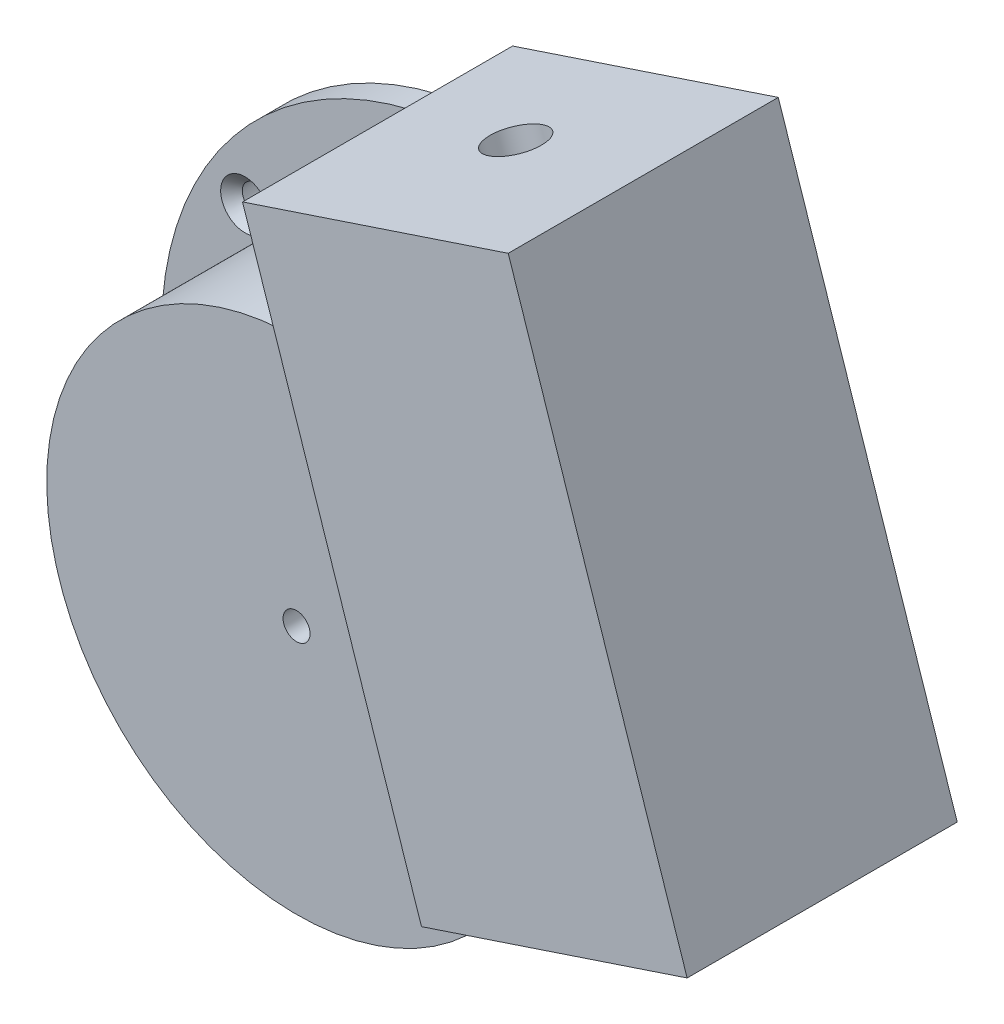
ISO-10303-21;
HEADER;
FILE_DESCRIPTION(('STEP AP214'),'2;1');
FILE_NAME('part.step','',(''),(''),'','','');
FILE_SCHEMA(('AUTOMOTIVE_DESIGN { 1 0 10303 214 1 1 1 1 }'));
ENDSEC;
DATA;
#1=APPLICATION_CONTEXT('core data for automotive mechanical design processes');
#2=APPLICATION_PROTOCOL_DEFINITION('international standard','automotive_design',2000,#1);
#3=PRODUCT_CONTEXT('',#1,'mechanical');
#4=PRODUCT('Part','Part','',(#3));
#5=PRODUCT_RELATED_PRODUCT_CATEGORY('part','',(#4));
#6=PRODUCT_DEFINITION_FORMATION('','',#4);
#7=PRODUCT_DEFINITION_CONTEXT('part definition',#1,'design');
#8=PRODUCT_DEFINITION('design','',#6,#7);
#9=PRODUCT_DEFINITION_SHAPE('','',#8);
#10=(LENGTH_UNIT() NAMED_UNIT(*) SI_UNIT(.MILLI.,.METRE.));
#11=(NAMED_UNIT(*) PLANE_ANGLE_UNIT() SI_UNIT($,.RADIAN.));
#12=(NAMED_UNIT(*) SI_UNIT($,.STERADIAN.) SOLID_ANGLE_UNIT());
#13=UNCERTAINTY_MEASURE_WITH_UNIT(LENGTH_MEASURE(1.E-05),#10,'distance_accuracy_value','');
#14=(GEOMETRIC_REPRESENTATION_CONTEXT(3) GLOBAL_UNCERTAINTY_ASSIGNED_CONTEXT((#13)) GLOBAL_UNIT_ASSIGNED_CONTEXT((#10,
#11,#12)) REPRESENTATION_CONTEXT('',''));
#15=CARTESIAN_POINT('',(0.,0.,0.));
#16=DIRECTION('',(0.,0.,1.));
#17=DIRECTION('',(1.,0.,0.));
#18=AXIS2_PLACEMENT_3D('',#15,#16,#17);
#19=CARTESIAN_POINT('',(32.9272256664057,-4.10602535899171,2.));
#20=DIRECTION('',(-0.315527594443914,0.948916401557291,0.));
#21=DIRECTION('',(-0.948916401557291,-0.315527594443914,0.));
#22=AXIS2_PLACEMENT_3D('',#19,#20,#21);
#23=PLANE('',#22);
#24=DIRECTION('',(0.948916401557291,0.315527594443914,0.));
#25=VECTOR('',#24,1.);
#26=CARTESIAN_POINT('',(32.9272256664057,-4.10602535899171,16.));
#27=LINE('',#26,#25);
#28=CARTESIAN_POINT('',(13.2519018054064,-10.6483378299088,16.));
#29=VERTEX_POINT('',#28);
#30=CARTESIAN_POINT('',(15.661571428601,-9.84708994509685,16.));
#31=VERTEX_POINT('',#30);
#32=EDGE_CURVE('E182',#29,#31,#27,.T.);
#33=ORIENTED_EDGE('',*,*,#32,.T.);
#34=DIRECTION('',(0.,0.,-1.));
#35=VECTOR('',#34,1.);
#36=CARTESIAN_POINT('',(15.661571428601,-9.84708994509684,14.));
#37=LINE('',#36,#35);
#38=CARTESIAN_POINT('',(15.661571428601,-9.84708994509684,2.));
#39=VERTEX_POINT('',#38);
#40=EDGE_CURVE('E56',#31,#39,#37,.T.);
#41=ORIENTED_EDGE('',*,*,#40,.T.);
#42=DIRECTION('',(0.948916401557291,0.315527594443914,0.));
#43=VECTOR('',#42,1.);
#44=CARTESIAN_POINT('',(13.2519018054064,-10.6483378299088,2.));
#45=LINE('',#44,#43);
#46=CARTESIAN_POINT('',(22.8075621656437,-7.47095094752316,2.));
#47=VERTEX_POINT('',#46);
#48=EDGE_CURVE('E231',#39,#47,#45,.T.);
#49=ORIENTED_EDGE('',*,*,#48,.T.);
#50=DIRECTION('',(0.,0.,-1.));
#51=VECTOR('',#50,1.);
#52=CARTESIAN_POINT('',(22.8075621656437,-7.47095094752316,2.));
#53=LINE('',#52,#51);
#54=CARTESIAN_POINT('',(22.8075621656437,-7.47095094752316,0.));
#55=VERTEX_POINT('',#54);
#56=EDGE_CURVE('E276',#47,#55,#53,.T.);
#57=ORIENTED_EDGE('',*,*,#56,.T.);
#58=DIRECTION('',(0.94891640155729,0.315527594443914,0.));
#59=VECTOR('',#58,1.);
#60=CARTESIAN_POINT('',(32.9272256664057,-4.10602535899171,0.));
#61=LINE('',#60,#59);
#62=CARTESIAN_POINT('',(32.9272256664057,-4.10602535899171,0.));
#63=VERTEX_POINT('',#62);
#64=EDGE_CURVE('E258',#55,#63,#61,.T.);
#65=ORIENTED_EDGE('',*,*,#64,.T.);
#66=DIRECTION('',(0.,0.,-1.));
#67=VECTOR('',#66,1.);
#68=CARTESIAN_POINT('',(32.9272256664057,-4.10602535899171,2.));
#69=LINE('',#68,#67);
#70=CARTESIAN_POINT('',(32.9272256664057,-4.10602535899171,20.));
#71=VERTEX_POINT('',#70);
#72=EDGE_CURVE('E273',#71,#63,#69,.T.);
#73=ORIENTED_EDGE('',*,*,#72,.F.);
#74=DIRECTION('',(0.948916401557291,0.315527594443914,0.));
#75=VECTOR('',#74,1.);
#76=CARTESIAN_POINT('',(32.9272256664057,-4.10602535899171,20.));
#77=LINE('',#76,#75);
#78=CARTESIAN_POINT('',(13.2519018054064,-10.6483378299088,20.));
#79=VERTEX_POINT('',#78);
#80=EDGE_CURVE('E196',#79,#71,#77,.T.);
#81=ORIENTED_EDGE('',*,*,#80,.F.);
#82=DIRECTION('',(0.,0.,-1.));
#83=VECTOR('',#82,1.);
#84=CARTESIAN_POINT('',(13.2519018054064,-10.6483378299088,18.));
#85=LINE('',#84,#83);
#86=EDGE_CURVE('E213',#79,#29,#85,.T.);
#87=ORIENTED_EDGE('',*,*,#86,.T.);
#88=EDGE_LOOP('',(#33,#41,#49,#57,#65,#73,#81,#87));
#89=FACE_BOUND('',#88,.T.);
#90=ADVANCED_FACE('F41',(#89),#23,.F.);
#91=CARTESIAN_POINT('',(1.7521545270351,23.9359552663643,2.));
#92=DIRECTION('',(0.94891640155729,0.315527594443914,0.));
#93=DIRECTION('',(-0.315527594443914,0.948916401557291,0.));
#94=AXIS2_PLACEMENT_3D('',#91,#92,#93);
#95=PLANE('',#94);
#96=DIRECTION('',(0.,0.,-1.));
#97=VECTOR('',#96,1.);
#98=CARTESIAN_POINT('',(3.68280478079866,18.1297255618094,14.));
#99=LINE('',#98,#97);
#100=CARTESIAN_POINT('',(3.68280478079866,18.1297255618094,16.));
#101=VERTEX_POINT('',#100);
#102=CARTESIAN_POINT('',(3.68280478079865,18.1297255618094,2.));
#103=VERTEX_POINT('',#102);
#104=EDGE_CURVE('E64',#101,#103,#99,.T.);
#105=ORIENTED_EDGE('',*,*,#104,.F.);
#106=DIRECTION('',(0.315527594443914,-0.948916401557291,0.));
#107=VECTOR('',#106,1.);
#108=CARTESIAN_POINT('',(1.7521545270351,23.9359552663643,16.));
#109=LINE('',#108,#107);
#110=EDGE_CURVE('E187',#101,#29,#109,.T.);
#111=ORIENTED_EDGE('',*,*,#110,.T.);
#112=ORIENTED_EDGE('',*,*,#86,.F.);
#113=DIRECTION('',(0.315527594443914,-0.948916401557291,0.));
#114=VECTOR('',#113,1.);
#115=CARTESIAN_POINT('',(13.2519018054064,-10.6483378299088,20.));
#116=LINE('',#115,#114);
#117=CARTESIAN_POINT('',(0.,29.2053776498383,20.));
#118=VERTEX_POINT('',#117);
#119=EDGE_CURVE('E193',#118,#79,#116,.T.);
#120=ORIENTED_EDGE('',*,*,#119,.F.);
#121=DIRECTION('',(0.,0.,-1.));
#122=VECTOR('',#121,1.);
#123=CARTESIAN_POINT('',(0.,29.2053776498383,2.));
#124=LINE('',#123,#122);
#125=CARTESIAN_POINT('',(0.,29.2053776498383,0.));
#126=VERTEX_POINT('',#125);
#127=EDGE_CURVE('E267',#118,#126,#124,.T.);
#128=ORIENTED_EDGE('',*,*,#127,.T.);
#129=DIRECTION('',(0.315527594443914,-0.94891640155729,0.));
#130=VECTOR('',#129,1.);
#131=CARTESIAN_POINT('',(1.7521545270351,23.9359552663643,0.));
#132=LINE('',#131,#130);
#133=CARTESIAN_POINT('',(1.7521545270351,23.9359552663643,0.));
#134=VERTEX_POINT('',#133);
#135=EDGE_CURVE('E255',#126,#134,#132,.T.);
#136=ORIENTED_EDGE('',*,*,#135,.T.);
#137=DIRECTION('',(0.,0.,-1.));
#138=VECTOR('',#137,1.);
#139=CARTESIAN_POINT('',(1.7521545270351,23.9359552663643,2.));
#140=LINE('',#139,#138);
#141=CARTESIAN_POINT('',(1.7521545270351,23.9359552663643,2.));
#142=VERTEX_POINT('',#141);
#143=EDGE_CURVE('E254',#142,#134,#140,.T.);
#144=ORIENTED_EDGE('',*,*,#143,.F.);
#145=DIRECTION('',(0.315527594443914,-0.948916401557291,0.));
#146=VECTOR('',#145,1.);
#147=CARTESIAN_POINT('',(0.,29.2053776498383,2.));
#148=LINE('',#147,#146);
#149=EDGE_CURVE('E220',#142,#103,#148,.T.);
#150=ORIENTED_EDGE('',*,*,#149,.T.);
#151=EDGE_LOOP('',(#105,#111,#112,#120,#128,#136,#144,#150));
#152=FACE_BOUND('',#151,.T.);
#153=ADVANCED_FACE('F310',(#152),#95,.F.);
#154=CARTESIAN_POINT('',(0.,0.,2.));
#155=DIRECTION('',(0.,0.,1.));
#156=DIRECTION('',(1.,0.,0.));
#157=AXIS2_PLACEMENT_3D('',#154,#155,#156);
#158=PLANE('',#157);
#159=CARTESIAN_POINT('',(0.714435954470893,20.9878436545291,2.));
#160=DIRECTION('',(0.,0.,1.));
#161=DIRECTION('',(1.,0.,0.));
#162=AXIS2_PLACEMENT_3D('',#159,#160,#161);
#163=CIRCLE('',#162,1.8);
#164=CARTESIAN_POINT('',(2.51443595447089,20.9878436545291,2.));
#165=VERTEX_POINT('',#164);
#166=EDGE_CURVE('E431',#165,#165,#163,.T.);
#167=ORIENTED_EDGE('',*,*,#166,.F.);
#168=EDGE_LOOP('',(#167));
#169=FACE_BOUND('',#168,.T.);
#170=CARTESIAN_POINT('',(-17.8187877982429,11.1126415132132,2.));
#171=DIRECTION('',(0.,0.,1.));
#172=DIRECTION('',(1.,0.,0.));
#173=AXIS2_PLACEMENT_3D('',#170,#171,#172);
#174=CIRCLE('',#173,1.8);
#175=CARTESIAN_POINT('',(-16.0187877982429,11.1126415132132,2.));
#176=VERTEX_POINT('',#175);
#177=EDGE_CURVE('E422',#176,#176,#174,.T.);
#178=ORIENTED_EDGE('',*,*,#177,.F.);
#179=EDGE_LOOP('',(#178));
#180=FACE_BOUND('',#179,.T.);
#181=CARTESIAN_POINT('',(-11.1126415132134,-17.8187877982428,2.));
#182=DIRECTION('',(0.,0.,1.));
#183=DIRECTION('',(1.,0.,0.));
#184=AXIS2_PLACEMENT_3D('',#181,#182,#183);
#185=CIRCLE('',#184,1.8);
#186=CARTESIAN_POINT('',(-9.31264151321336,-17.8187877982428,2.));
#187=VERTEX_POINT('',#186);
#188=EDGE_CURVE('E413',#187,#187,#185,.T.);
#189=ORIENTED_EDGE('',*,*,#188,.F.);
#190=EDGE_LOOP('',(#189));
#191=FACE_BOUND('',#190,.T.);
#192=CARTESIAN_POINT('',(17.8187877982429,-11.1126415132132,2.));
#193=DIRECTION('',(0.,0.,1.));
#194=DIRECTION('',(1.,0.,0.));
#195=AXIS2_PLACEMENT_3D('',#192,#193,#194);
#196=CIRCLE('',#195,1.8);
#197=CARTESIAN_POINT('',(19.6187877982429,-11.1126415132132,2.));
#198=VERTEX_POINT('',#197);
#199=EDGE_CURVE('E404',#198,#198,#196,.T.);
#200=ORIENTED_EDGE('',*,*,#199,.F.);
#201=EDGE_LOOP('',(#200));
#202=FACE_BOUND('',#201,.T.);
#203=CARTESIAN_POINT('',(0.,0.,2.));
#204=DIRECTION('',(0.,0.,1.));
#205=DIRECTION('',(1.,0.,0.));
#206=AXIS2_PLACEMENT_3D('',#203,#204,#205);
#207=CIRCLE('',#206,18.5);
#208=EDGE_CURVE('E242',#103,#39,#207,.T.);
#209=ORIENTED_EDGE('',*,*,#208,.F.);
#210=ORIENTED_EDGE('',*,*,#149,.F.);
#211=CARTESIAN_POINT('',(0.,0.,2.));
#212=DIRECTION('',(0.,0.,1.));
#213=DIRECTION('',(1.,0.,0.));
#214=AXIS2_PLACEMENT_3D('',#211,#212,#213);
#215=CIRCLE('',#214,24.);
#216=EDGE_CURVE('E251',#142,#47,#215,.T.);
#217=ORIENTED_EDGE('',*,*,#216,.T.);
#218=ORIENTED_EDGE('',*,*,#48,.F.);
#219=EDGE_LOOP('',(#209,#210,#217,#218));
#220=FACE_BOUND('',#219,.T.);
#221=ADVANCED_FACE('F321',(#169,#180,#191,#202,#220),#158,.T.);
#222=CARTESIAN_POINT('',(0.,0.,2.));
#223=DIRECTION('',(0.,0.,1.));
#224=DIRECTION('',(1.,0.,0.));
#225=AXIS2_PLACEMENT_3D('',#222,#223,#224);
#226=CIRCLE('',#225,17.);
#227=CARTESIAN_POINT('',(15.0261921142841,-7.95069497243023,2.));
#228=VERTEX_POINT('',#227);
#229=CARTESIAN_POINT('',(6.61107226700096,15.6618556844485,2.));
#230=VERTEX_POINT('',#229);
#231=EDGE_CURVE('E216',#228,#230,#226,.T.);
#232=ORIENTED_EDGE('',*,*,#231,.F.);
#233=DIRECTION('',(-0.948916401557291,-0.315527594443914,0.));
#234=VECTOR('',#233,1.);
#235=CARTESIAN_POINT('',(30.3983376744034,-2.83924774476495,2.));
#236=LINE('',#235,#234);
#237=CARTESIAN_POINT('',(30.3983376744034,-2.83924774476495,2.));
#238=VERTEX_POINT('',#237);
#239=EDGE_CURVE('E228',#238,#228,#236,.T.);
#240=ORIENTED_EDGE('',*,*,#239,.F.);
#241=DIRECTION('',(0.315527594443914,-0.948916401557291,0.));
#242=VECTOR('',#241,1.);
#243=CARTESIAN_POINT('',(18.4085462467726,33.218802128753,2.));
#244=LINE('',#243,#242);
#245=CARTESIAN_POINT('',(18.4085462467726,33.218802128753,2.));
#246=VERTEX_POINT('',#245);
#247=EDGE_CURVE('E226',#246,#238,#244,.T.);
#248=ORIENTED_EDGE('',*,*,#247,.F.);
#249=DIRECTION('',(0.948916401557291,0.315527594443913,0.));
#250=VECTOR('',#249,1.);
#251=CARTESIAN_POINT('',(2.52888799200241,27.9386000356115,2.));
#252=LINE('',#251,#250);
#253=CARTESIAN_POINT('',(2.52888799200241,27.9386000356115,2.));
#254=VERTEX_POINT('',#253);
#255=EDGE_CURVE('E224',#254,#246,#252,.T.);
#256=ORIENTED_EDGE('',*,*,#255,.F.);
#257=DIRECTION('',(-0.315527594443914,0.948916401557291,0.));
#258=VECTOR('',#257,1.);
#259=CARTESIAN_POINT('',(9.20072700457541,7.87373858113837,2.));
#260=LINE('',#259,#258);
#261=EDGE_CURVE('E222',#230,#254,#260,.T.);
#262=ORIENTED_EDGE('',*,*,#261,.F.);
#263=EDGE_LOOP('',(#232,#240,#248,#256,#262));
#264=FACE_BOUND('',#263,.T.);
#265=ADVANCED_FACE('F292',(#264),#158,.T.);
#266=CARTESIAN_POINT('',(0.,0.,0.));
#267=DIRECTION('',(0.,0.,1.));
#268=DIRECTION('',(1.,0.,0.));
#269=AXIS2_PLACEMENT_3D('',#266,#267,#268);
#270=PLANE('',#269);
#271=CARTESIAN_POINT('',(0.714435954470893,20.9878436545291,0.));
#272=DIRECTION('',(0.,0.,1.));
#273=DIRECTION('',(1.,0.,0.));
#274=AXIS2_PLACEMENT_3D('',#271,#272,#273);
#275=CIRCLE('',#274,0.999999999999987);
#276=CARTESIAN_POINT('',(1.71443595447088,20.9878436545291,0.));
#277=VERTEX_POINT('',#276);
#278=EDGE_CURVE('E425',#277,#277,#275,.T.);
#279=ORIENTED_EDGE('',*,*,#278,.T.);
#280=EDGE_LOOP('',(#279));
#281=FACE_BOUND('',#280,.T.);
#282=CARTESIAN_POINT('',(-17.8187877982429,11.1126415132132,0.));
#283=DIRECTION('',(0.,0.,1.));
#284=DIRECTION('',(1.,0.,0.));
#285=AXIS2_PLACEMENT_3D('',#282,#283,#284);
#286=CIRCLE('',#285,0.999999999999987);
#287=CARTESIAN_POINT('',(-16.8187877982429,11.1126415132132,0.));
#288=VERTEX_POINT('',#287);
#289=EDGE_CURVE('E416',#288,#288,#286,.T.);
#290=ORIENTED_EDGE('',*,*,#289,.T.);
#291=EDGE_LOOP('',(#290));
#292=FACE_BOUND('',#291,.T.);
#293=CARTESIAN_POINT('',(-11.1126415132134,-17.8187877982428,0.));
#294=DIRECTION('',(0.,0.,1.));
#295=DIRECTION('',(1.,0.,0.));
#296=AXIS2_PLACEMENT_3D('',#293,#294,#295);
#297=CIRCLE('',#296,0.999999999999987);
#298=CARTESIAN_POINT('',(-10.1126415132134,-17.8187877982428,0.));
#299=VERTEX_POINT('',#298);
#300=EDGE_CURVE('E407',#299,#299,#297,.T.);
#301=ORIENTED_EDGE('',*,*,#300,.T.);
#302=EDGE_LOOP('',(#301));
#303=FACE_BOUND('',#302,.T.);
#304=CARTESIAN_POINT('',(17.8187877982429,-11.1126415132132,0.));
#305=DIRECTION('',(0.,0.,1.));
#306=DIRECTION('',(1.,0.,0.));
#307=AXIS2_PLACEMENT_3D('',#304,#305,#306);
#308=CIRCLE('',#307,0.999999999999987);
#309=CARTESIAN_POINT('',(18.8187877982429,-11.1126415132132,0.));
#310=VERTEX_POINT('',#309);
#311=EDGE_CURVE('E396',#310,#310,#308,.T.);
#312=ORIENTED_EDGE('',*,*,#311,.T.);
#313=EDGE_LOOP('',(#312));
#314=FACE_BOUND('',#313,.T.);
#315=CARTESIAN_POINT('',(0.,0.,0.));
#316=DIRECTION('',(0.,0.,1.));
#317=DIRECTION('',(1.,0.,0.));
#318=AXIS2_PLACEMENT_3D('',#315,#316,#317);
#319=CIRCLE('',#318,24.);
#320=EDGE_CURVE('E250',#134,#55,#319,.T.);
#321=ORIENTED_EDGE('',*,*,#320,.F.);
#322=ORIENTED_EDGE('',*,*,#135,.F.);
#323=DIRECTION('',(-0.948916401557291,-0.315527594443913,0.));
#324=VECTOR('',#323,1.);
#325=CARTESIAN_POINT('',(0.,29.2053776498383,0.));
#326=LINE('',#325,#324);
#327=CARTESIAN_POINT('',(19.6753238609994,35.7476901207554,0.));
#328=VERTEX_POINT('',#327);
#329=EDGE_CURVE('E262',#328,#126,#326,.T.);
#330=ORIENTED_EDGE('',*,*,#329,.F.);
#331=DIRECTION('',(-0.315527594443913,0.948916401557291,0.));
#332=VECTOR('',#331,1.);
#333=CARTESIAN_POINT('',(19.6753238609994,35.7476901207554,0.));
#334=LINE('',#333,#332);
#335=EDGE_CURVE('E260',#63,#328,#334,.T.);
#336=ORIENTED_EDGE('',*,*,#335,.F.);
#337=ORIENTED_EDGE('',*,*,#64,.F.);
#338=EDGE_LOOP('',(#321,#322,#330,#336,#337));
#339=FACE_BOUND('',#338,.T.);
#340=CARTESIAN_POINT('',(0.,0.,0.));
#341=DIRECTION('',(0.,0.,1.));
#342=DIRECTION('',(1.,0.,0.));
#343=AXIS2_PLACEMENT_3D('',#340,#341,#342);
#344=CIRCLE('',#343,17.);
#345=CARTESIAN_POINT('',(17.,0.,0.));
#346=VERTEX_POINT('',#345);
#347=EDGE_CURVE('E247',#346,#346,#344,.T.);
#348=ORIENTED_EDGE('',*,*,#347,.T.);
#349=EDGE_LOOP('',(#348));
#350=FACE_BOUND('',#349,.T.);
#351=ADVANCED_FACE('F329',(#281,#292,#303,#314,#339,#350),#270,.F.);
#352=CARTESIAN_POINT('',(0.,0.,2.));
#353=DIRECTION('',(0.,0.,-1.));
#354=DIRECTION('',(-1.,0.,0.));
#355=AXIS2_PLACEMENT_3D('',#352,#353,#354);
#356=CYLINDRICAL_SURFACE('',#355,24.);
#357=ORIENTED_EDGE('',*,*,#320,.T.);
#358=ORIENTED_EDGE('',*,*,#56,.F.);
#359=ORIENTED_EDGE('',*,*,#216,.F.);
#360=ORIENTED_EDGE('',*,*,#143,.T.);
#361=EDGE_LOOP('',(#357,#358,#359,#360));
#362=FACE_BOUND('',#361,.T.);
#363=ADVANCED_FACE('F43',(#362),#356,.T.);
#364=CARTESIAN_POINT('',(19.6753238609994,35.7476901207554,2.));
#365=DIRECTION('',(-0.948916401557291,-0.315527594443913,0.));
#366=DIRECTION('',(0.315527594443913,-0.948916401557291,0.));
#367=AXIS2_PLACEMENT_3D('',#364,#365,#366);
#368=PLANE('',#367);
#369=ORIENTED_EDGE('',*,*,#335,.T.);
#370=DIRECTION('',(0.,0.,-1.));
#371=VECTOR('',#370,1.);
#372=CARTESIAN_POINT('',(19.6753238609994,35.7476901207554,2.));
#373=LINE('',#372,#371);
#374=CARTESIAN_POINT('',(19.6753238609994,35.7476901207554,20.));
#375=VERTEX_POINT('',#374);
#376=EDGE_CURVE('E270',#375,#328,#373,.T.);
#377=ORIENTED_EDGE('',*,*,#376,.F.);
#378=DIRECTION('',(-0.315527594443913,0.948916401557291,0.));
#379=VECTOR('',#378,1.);
#380=CARTESIAN_POINT('',(32.9272256664057,-4.10602535899171,20.));
#381=LINE('',#380,#379);
#382=EDGE_CURVE('E181',#71,#375,#381,.T.);
#383=ORIENTED_EDGE('',*,*,#382,.F.);
#384=ORIENTED_EDGE('',*,*,#72,.T.);
#385=EDGE_LOOP('',(#369,#377,#383,#384));
#386=FACE_BOUND('',#385,.T.);
#387=ADVANCED_FACE('F334',(#386),#368,.F.);
#388=CARTESIAN_POINT('',(0.,29.2053776498383,2.));
#389=DIRECTION('',(0.315527594443914,-0.948916401557291,0.));
#390=DIRECTION('',(0.948916401557291,0.315527594443914,0.));
#391=AXIS2_PLACEMENT_3D('',#388,#389,#390);
#392=PLANE('',#391);
#393=CARTESIAN_POINT('',(9.2320076596834,32.275145612503,9.));
#394=DIRECTION('',(-0.315527594443914,0.948916401557291,0.));
#395=DIRECTION('',(-0.948916401557291,-0.315527594443914,0.));
#396=AXIS2_PLACEMENT_3D('',#393,#394,#395);
#397=CIRCLE('',#396,2.);
#398=CARTESIAN_POINT('',(7.33417485656882,31.6440904236152,9.));
#399=VERTEX_POINT('',#398);
#400=EDGE_CURVE('E393',#399,#399,#397,.T.);
#401=ORIENTED_EDGE('',*,*,#400,.F.);
#402=EDGE_LOOP('',(#401));
#403=FACE_BOUND('',#402,.T.);
#404=ORIENTED_EDGE('',*,*,#329,.T.);
#405=ORIENTED_EDGE('',*,*,#127,.F.);
#406=DIRECTION('',(-0.948916401557291,-0.315527594443913,0.));
#407=VECTOR('',#406,1.);
#408=CARTESIAN_POINT('',(19.6753238609994,35.7476901207554,20.));
#409=LINE('',#408,#407);
#410=EDGE_CURVE('E185',#375,#118,#409,.T.);
#411=ORIENTED_EDGE('',*,*,#410,.F.);
#412=ORIENTED_EDGE('',*,*,#376,.T.);
#413=EDGE_LOOP('',(#404,#405,#411,#412));
#414=FACE_BOUND('',#413,.T.);
#415=ADVANCED_FACE('F338',(#403,#414),#392,.F.);
#416=CARTESIAN_POINT('',(0.,0.,2.));
#417=DIRECTION('',(0.,0.,-1.));
#418=DIRECTION('',(-1.,0.,0.));
#419=AXIS2_PLACEMENT_3D('',#416,#417,#418);
#420=CYLINDRICAL_SURFACE('',#419,17.);
#421=ORIENTED_EDGE('',*,*,#347,.F.);
#422=EDGE_LOOP('',(#421));
#423=FACE_BOUND('',#422,.T.);
#424=CARTESIAN_POINT('',(0.,0.,14.));
#425=DIRECTION('',(0.,0.,-1.));
#426=DIRECTION('',(1.,0.,0.));
#427=AXIS2_PLACEMENT_3D('',#424,#425,#426);
#428=CIRCLE('',#427,17.);
#429=CARTESIAN_POINT('',(15.0261921142841,-7.95069497243023,14.));
#430=VERTEX_POINT('',#429);
#431=CARTESIAN_POINT('',(6.61107226700095,15.6618556844485,14.));
#432=VERTEX_POINT('',#431);
#433=EDGE_CURVE('E161',#430,#432,#428,.T.);
#434=ORIENTED_EDGE('',*,*,#433,.F.);
#435=DIRECTION('',(0.,0.,1.));
#436=VECTOR('',#435,1.);
#437=CARTESIAN_POINT('',(15.0261921142841,-7.95069497243023,-10.));
#438=LINE('',#437,#436);
#439=EDGE_CURVE('E279',#228,#430,#438,.T.);
#440=ORIENTED_EDGE('',*,*,#439,.F.);
#441=ORIENTED_EDGE('',*,*,#231,.T.);
#442=DIRECTION('',(0.,0.,1.));
#443=VECTOR('',#442,1.);
#444=CARTESIAN_POINT('',(6.61107226700096,15.6618556844485,-10.));
#445=LINE('',#444,#443);
#446=EDGE_CURVE('E218',#432,#230,#445,.F.);
#447=ORIENTED_EDGE('',*,*,#446,.F.);
#448=EDGE_LOOP('',(#434,#440,#441,#447));
#449=FACE_BOUND('',#448,.T.);
#450=ADVANCED_FACE('F285',(#423,#449),#420,.F.);
#451=CARTESIAN_POINT('',(0.,0.,14.));
#452=DIRECTION('',(0.,0.,-1.));
#453=DIRECTION('',(-1.,0.,0.));
#454=AXIS2_PLACEMENT_3D('',#451,#452,#453);
#455=CYLINDRICAL_SURFACE('',#454,18.5);
#456=ORIENTED_EDGE('',*,*,#208,.T.);
#457=ORIENTED_EDGE('',*,*,#40,.F.);
#458=CARTESIAN_POINT('',(0.,0.,16.));
#459=DIRECTION('',(0.,0.,1.));
#460=DIRECTION('',(1.,0.,0.));
#461=AXIS2_PLACEMENT_3D('',#458,#459,#460);
#462=CIRCLE('',#461,18.5);
#463=EDGE_CURVE('E167',#101,#31,#462,.T.);
#464=ORIENTED_EDGE('',*,*,#463,.F.);
#465=ORIENTED_EDGE('',*,*,#104,.T.);
#466=EDGE_LOOP('',(#456,#457,#464,#465));
#467=FACE_BOUND('',#466,.T.);
#468=ADVANCED_FACE('F317',(#467),#455,.T.);
#469=CARTESIAN_POINT('',(9.20072700457541,7.87373858113837,14.));
#470=DIRECTION('',(-0.948916401557291,-0.315527594443914,0.));
#471=DIRECTION('',(0.315527594443914,-0.948916401557291,0.));
#472=AXIS2_PLACEMENT_3D('',#469,#470,#471);
#473=PLANE('',#472);
#474=DIRECTION('',(0.,0.,-1.));
#475=VECTOR('',#474,1.);
#476=CARTESIAN_POINT('',(14.5186794196331,-8.11944983790643,18.));
#477=LINE('',#476,#475);
#478=CARTESIAN_POINT('',(14.5186794196331,-8.11944983790643,18.));
#479=VERTEX_POINT('',#478);
#480=CARTESIAN_POINT('',(14.5186794196331,-8.11944983790643,16.));
#481=VERTEX_POINT('',#480);
#482=EDGE_CURVE('E211',#479,#481,#477,.T.);
#483=ORIENTED_EDGE('',*,*,#482,.T.);
#484=DIRECTION('',(-0.315527594443914,0.948916401557291,0.));
#485=VECTOR('',#484,1.);
#486=CARTESIAN_POINT('',(9.20072700457541,7.87373858113837,16.));
#487=LINE('',#486,#485);
#488=CARTESIAN_POINT('',(5.9998468517214,17.5000525072323,16.));
#489=VERTEX_POINT('',#488);
#490=EDGE_CURVE('E166',#481,#489,#487,.T.);
#491=ORIENTED_EDGE('',*,*,#490,.T.);
#492=DIRECTION('',(0.,0.,-1.));
#493=VECTOR('',#492,1.);
#494=CARTESIAN_POINT('',(5.9998468517214,17.5000525072323,16.));
#495=LINE('',#494,#493);
#496=CARTESIAN_POINT('',(5.9998468517214,17.5000525072323,14.));
#497=VERTEX_POINT('',#496);
#498=EDGE_CURVE('E172',#497,#489,#495,.F.);
#499=ORIENTED_EDGE('',*,*,#498,.F.);
#500=DIRECTION('',(-0.315527594443914,0.948916401557291,0.));
#501=VECTOR('',#500,1.);
#502=CARTESIAN_POINT('',(9.20072700457541,7.87373858113837,14.));
#503=LINE('',#502,#501);
#504=EDGE_CURVE('E155',#432,#497,#503,.T.);
#505=ORIENTED_EDGE('',*,*,#504,.F.);
#506=ORIENTED_EDGE('',*,*,#446,.T.);
#507=ORIENTED_EDGE('',*,*,#261,.T.);
#508=DIRECTION('',(0.,0.,-1.));
#509=VECTOR('',#508,1.);
#510=CARTESIAN_POINT('',(2.52888799200241,27.9386000356115,14.));
#511=LINE('',#510,#509);
#512=CARTESIAN_POINT('',(2.52888799200241,27.9386000356115,18.));
#513=VERTEX_POINT('',#512);
#514=EDGE_CURVE('E239',#513,#254,#511,.T.);
#515=ORIENTED_EDGE('',*,*,#514,.F.);
#516=DIRECTION('',(0.315527594443914,-0.948916401557291,0.));
#517=VECTOR('',#516,1.);
#518=CARTESIAN_POINT('',(14.5186794196331,-8.11944983790643,18.));
#519=LINE('',#518,#517);
#520=EDGE_CURVE('E205',#513,#479,#519,.T.);
#521=ORIENTED_EDGE('',*,*,#520,.T.);
#522=EDGE_LOOP('',(#483,#491,#499,#505,#506,#507,#515,#521));
#523=FACE_BOUND('',#522,.T.);
#524=ADVANCED_FACE('F180',(#523),#473,.F.);
#525=CARTESIAN_POINT('',(2.52888799200241,27.9386000356115,14.));
#526=DIRECTION('',(-0.315527594443913,0.948916401557291,0.));
#527=DIRECTION('',(-0.948916401557291,-0.315527594443913,0.));
#528=AXIS2_PLACEMENT_3D('',#525,#526,#527);
#529=PLANE('',#528);
#530=CARTESIAN_POINT('',(9.86306284857123,30.3773128093884,9.));
#531=DIRECTION('',(-0.315527594443914,0.948916401557291,0.));
#532=DIRECTION('',(-0.948916401557291,-0.315527594443914,0.));
#533=AXIS2_PLACEMENT_3D('',#530,#531,#532);
#534=CIRCLE('',#533,2.);
#535=CARTESIAN_POINT('',(7.96523004545665,29.7462576205006,9.));
#536=VERTEX_POINT('',#535);
#537=EDGE_CURVE('E391',#536,#536,#534,.T.);
#538=ORIENTED_EDGE('',*,*,#537,.T.);
#539=EDGE_LOOP('',(#538));
#540=FACE_BOUND('',#539,.T.);
#541=ORIENTED_EDGE('',*,*,#255,.T.);
#542=DIRECTION('',(0.,0.,-1.));
#543=VECTOR('',#542,1.);
#544=CARTESIAN_POINT('',(18.4085462467726,33.218802128753,14.));
#545=LINE('',#544,#543);
#546=CARTESIAN_POINT('',(18.4085462467726,33.218802128753,18.));
#547=VERTEX_POINT('',#546);
#548=EDGE_CURVE('E236',#547,#246,#545,.T.);
#549=ORIENTED_EDGE('',*,*,#548,.F.);
#550=DIRECTION('',(-0.948916401557291,-0.315527594443913,0.));
#551=VECTOR('',#550,1.);
#552=CARTESIAN_POINT('',(18.4085462467726,33.218802128753,18.));
#553=LINE('',#552,#551);
#554=EDGE_CURVE('E202',#547,#513,#553,.T.);
#555=ORIENTED_EDGE('',*,*,#554,.T.);
#556=ORIENTED_EDGE('',*,*,#514,.T.);
#557=EDGE_LOOP('',(#541,#549,#555,#556));
#558=FACE_BOUND('',#557,.T.);
#559=ADVANCED_FACE('F297',(#540,#558),#529,.F.);
#560=CARTESIAN_POINT('',(18.4085462467726,33.218802128753,14.));
#561=DIRECTION('',(0.94891640155729,0.315527594443914,0.));
#562=DIRECTION('',(-0.315527594443914,0.948916401557291,0.));
#563=AXIS2_PLACEMENT_3D('',#560,#561,#562);
#564=PLANE('',#563);
#565=ORIENTED_EDGE('',*,*,#247,.T.);
#566=DIRECTION('',(0.,0.,-1.));
#567=VECTOR('',#566,1.);
#568=CARTESIAN_POINT('',(30.3983376744034,-2.83924774476495,14.));
#569=LINE('',#568,#567);
#570=CARTESIAN_POINT('',(30.3983376744034,-2.83924774476495,18.));
#571=VERTEX_POINT('',#570);
#572=EDGE_CURVE('E233',#571,#238,#569,.T.);
#573=ORIENTED_EDGE('',*,*,#572,.F.);
#574=DIRECTION('',(-0.315527594443914,0.948916401557291,0.));
#575=VECTOR('',#574,1.);
#576=CARTESIAN_POINT('',(30.3983376744034,-2.83924774476495,18.));
#577=LINE('',#576,#575);
#578=EDGE_CURVE('E199',#571,#547,#577,.T.);
#579=ORIENTED_EDGE('',*,*,#578,.T.);
#580=ORIENTED_EDGE('',*,*,#548,.T.);
#581=EDGE_LOOP('',(#565,#573,#579,#580));
#582=FACE_BOUND('',#581,.T.);
#583=ADVANCED_FACE('F376',(#582),#564,.F.);
#584=CARTESIAN_POINT('',(30.3983376744034,-2.83924774476495,14.));
#585=DIRECTION('',(0.315527594443914,-0.948916401557291,0.));
#586=DIRECTION('',(0.948916401557291,0.315527594443914,0.));
#587=AXIS2_PLACEMENT_3D('',#584,#585,#586);
#588=PLANE('',#587);
#589=DIRECTION('',(0.,0.,-1.));
#590=VECTOR('',#589,1.);
#591=CARTESIAN_POINT('',(17.0014429749983,-7.29389722767462,16.));
#592=LINE('',#591,#590);
#593=CARTESIAN_POINT('',(17.0014429749983,-7.29389722767462,16.));
#594=VERTEX_POINT('',#593);
#595=CARTESIAN_POINT('',(17.0014429749983,-7.29389722767462,14.));
#596=VERTEX_POINT('',#595);
#597=EDGE_CURVE('E49',#594,#596,#592,.T.);
#598=ORIENTED_EDGE('',*,*,#597,.F.);
#599=DIRECTION('',(-0.948916401557291,-0.315527594443914,0.));
#600=VECTOR('',#599,1.);
#601=CARTESIAN_POINT('',(30.3983376744034,-2.83924774476495,16.));
#602=LINE('',#601,#600);
#603=EDGE_CURVE('E11',#594,#481,#602,.T.);
#604=ORIENTED_EDGE('',*,*,#603,.T.);
#605=ORIENTED_EDGE('',*,*,#482,.F.);
#606=DIRECTION('',(0.94891640155729,0.315527594443914,0.));
#607=VECTOR('',#606,1.);
#608=CARTESIAN_POINT('',(30.3983376744034,-2.83924774476495,18.));
#609=LINE('',#608,#607);
#610=EDGE_CURVE('E208',#479,#571,#609,.T.);
#611=ORIENTED_EDGE('',*,*,#610,.T.);
#612=ORIENTED_EDGE('',*,*,#572,.T.);
#613=ORIENTED_EDGE('',*,*,#239,.T.);
#614=ORIENTED_EDGE('',*,*,#439,.T.);
#615=DIRECTION('',(-0.948916401557291,-0.315527594443914,0.));
#616=VECTOR('',#615,1.);
#617=CARTESIAN_POINT('',(30.3983376744034,-2.83924774476495,14.));
#618=LINE('',#617,#616);
#619=EDGE_CURVE('E282',#596,#430,#618,.T.);
#620=ORIENTED_EDGE('',*,*,#619,.F.);
#621=EDGE_LOOP('',(#598,#604,#605,#611,#612,#613,#614,#620));
#622=FACE_BOUND('',#621,.T.);
#623=ADVANCED_FACE('F287',(#622),#588,.F.);
#624=CARTESIAN_POINT('',(0.,0.,14.));
#625=DIRECTION('',(0.,0.,1.));
#626=DIRECTION('',(1.,0.,0.));
#627=AXIS2_PLACEMENT_3D('',#624,#625,#626);
#628=PLANE('',#627);
#629=CARTESIAN_POINT('',(0.,0.,14.));
#630=DIRECTION('',(0.,0.,1.));
#631=DIRECTION('',(1.,0.,0.));
#632=AXIS2_PLACEMENT_3D('',#629,#630,#631);
#633=CIRCLE('',#632,1.);
#634=CARTESIAN_POINT('',(1.,0.,14.));
#635=VERTEX_POINT('',#634);
#636=EDGE_CURVE('E176',#635,#635,#633,.T.);
#637=ORIENTED_EDGE('',*,*,#636,.T.);
#638=EDGE_LOOP('',(#637));
#639=FACE_BOUND('',#638,.T.);
#640=ORIENTED_EDGE('',*,*,#433,.T.);
#641=ORIENTED_EDGE('',*,*,#504,.T.);
#642=CARTESIAN_POINT('',(0.,0.,14.));
#643=DIRECTION('',(0.,0.,1.));
#644=DIRECTION('',(1.,0.,0.));
#645=AXIS2_PLACEMENT_3D('',#642,#643,#644);
#646=CIRCLE('',#645,18.5);
#647=EDGE_CURVE('E158',#596,#497,#646,.T.);
#648=ORIENTED_EDGE('',*,*,#647,.F.);
#649=ORIENTED_EDGE('',*,*,#619,.T.);
#650=EDGE_LOOP('',(#640,#641,#648,#649));
#651=FACE_BOUND('',#650,.T.);
#652=ADVANCED_FACE('F157',(#639,#651),#628,.F.);
#653=CARTESIAN_POINT('',(0.,0.,18.));
#654=DIRECTION('',(0.,0.,1.));
#655=DIRECTION('',(1.,0.,0.));
#656=AXIS2_PLACEMENT_3D('',#653,#654,#655);
#657=PLANE('',#656);
#658=ORIENTED_EDGE('',*,*,#554,.F.);
#659=ORIENTED_EDGE('',*,*,#578,.F.);
#660=ORIENTED_EDGE('',*,*,#610,.F.);
#661=ORIENTED_EDGE('',*,*,#520,.F.);
#662=EDGE_LOOP('',(#658,#659,#660,#661));
#663=FACE_BOUND('',#662,.T.);
#664=ADVANCED_FACE('F300',(#663),#657,.F.);
#665=CARTESIAN_POINT('',(0.,0.,20.));
#666=DIRECTION('',(0.,0.,1.));
#667=DIRECTION('',(1.,0.,0.));
#668=AXIS2_PLACEMENT_3D('',#665,#666,#667);
#669=PLANE('',#668);
#670=ORIENTED_EDGE('',*,*,#382,.T.);
#671=ORIENTED_EDGE('',*,*,#410,.T.);
#672=ORIENTED_EDGE('',*,*,#119,.T.);
#673=ORIENTED_EDGE('',*,*,#80,.T.);
#674=EDGE_LOOP('',(#670,#671,#672,#673));
#675=FACE_BOUND('',#674,.T.);
#676=ADVANCED_FACE('F340',(#675),#669,.T.);
#677=CARTESIAN_POINT('',(0.,0.,16.));
#678=DIRECTION('',(0.,0.,1.));
#679=DIRECTION('',(1.,0.,0.));
#680=AXIS2_PLACEMENT_3D('',#677,#678,#679);
#681=PLANE('',#680);
#682=ORIENTED_EDGE('',*,*,#490,.F.);
#683=ORIENTED_EDGE('',*,*,#603,.F.);
#684=EDGE_CURVE('E175',#594,#489,#462,.T.);
#685=ORIENTED_EDGE('',*,*,#684,.T.);
#686=EDGE_LOOP('',(#682,#683,#685));
#687=FACE_BOUND('',#686,.T.);
#688=ADVANCED_FACE('F303',(#687),#681,.T.);
#689=CARTESIAN_POINT('',(0.,0.,16.));
#690=DIRECTION('',(0.,0.,-1.));
#691=DIRECTION('',(-1.,0.,0.));
#692=AXIS2_PLACEMENT_3D('',#689,#690,#691);
#693=CYLINDRICAL_SURFACE('',#692,18.5);
#694=ORIENTED_EDGE('',*,*,#647,.T.);
#695=ORIENTED_EDGE('',*,*,#498,.T.);
#696=ORIENTED_EDGE('',*,*,#684,.F.);
#697=ORIENTED_EDGE('',*,*,#597,.T.);
#698=EDGE_LOOP('',(#694,#695,#696,#697));
#699=FACE_BOUND('',#698,.T.);
#700=ADVANCED_FACE('F170',(#699),#693,.T.);
#701=CARTESIAN_POINT('',(0.,0.,16.));
#702=DIRECTION('',(0.,0.,1.));
#703=DIRECTION('',(1.,0.,0.));
#704=AXIS2_PLACEMENT_3D('',#701,#702,#703);
#705=CIRCLE('',#704,1.);
#706=CARTESIAN_POINT('',(1.,0.,16.));
#707=VERTEX_POINT('',#706);
#708=EDGE_CURVE('E307',#707,#707,#705,.T.);
#709=ORIENTED_EDGE('',*,*,#708,.F.);
#710=EDGE_LOOP('',(#709));
#711=FACE_BOUND('',#710,.T.);
#712=ORIENTED_EDGE('',*,*,#32,.F.);
#713=ORIENTED_EDGE('',*,*,#110,.F.);
#714=ORIENTED_EDGE('',*,*,#463,.T.);
#715=EDGE_LOOP('',(#712,#713,#714));
#716=FACE_BOUND('',#715,.T.);
#717=ADVANCED_FACE('F316',(#711,#716),#681,.T.);
#718=CARTESIAN_POINT('',(0.,0.,14.));
#719=DIRECTION('',(0.,0.,1.));
#720=DIRECTION('',(1.,0.,0.));
#721=AXIS2_PLACEMENT_3D('',#718,#719,#720);
#722=CYLINDRICAL_SURFACE('',#721,1.);
#723=ORIENTED_EDGE('',*,*,#636,.F.);
#724=EDGE_LOOP('',(#723));
#725=FACE_BOUND('',#724,.T.);
#726=ORIENTED_EDGE('',*,*,#708,.T.);
#727=EDGE_LOOP('',(#726));
#728=FACE_BOUND('',#727,.T.);
#729=ADVANCED_FACE('F464',(#725,#728),#722,.F.);
#730=CARTESIAN_POINT('',(9.86306284857123,30.3773128093884,9.));
#731=DIRECTION('',(-0.315527594443914,0.948916401557291,0.));
#732=DIRECTION('',(-0.948916401557291,-0.315527594443914,0.));
#733=AXIS2_PLACEMENT_3D('',#730,#731,#732);
#734=CYLINDRICAL_SURFACE('',#733,2.);
#735=ORIENTED_EDGE('',*,*,#537,.F.);
#736=EDGE_LOOP('',(#735));
#737=FACE_BOUND('',#736,.T.);
#738=ORIENTED_EDGE('',*,*,#400,.T.);
#739=EDGE_LOOP('',(#738));
#740=FACE_BOUND('',#739,.T.);
#741=ADVANCED_FACE('F456',(#737,#740),#734,.F.);
#742=CARTESIAN_POINT('',(17.8187877982429,-11.1126415132132,2.));
#743=DIRECTION('',(0.,0.,1.));
#744=DIRECTION('',(1.,0.,0.));
#745=AXIS2_PLACEMENT_3D('',#742,#743,#744);
#746=CYLINDRICAL_SURFACE('',#745,0.999999999999994);
#747=ORIENTED_EDGE('',*,*,#311,.F.);
#748=EDGE_LOOP('',(#747));
#749=FACE_BOUND('',#748,.T.);
#750=CARTESIAN_POINT('',(17.8187877982429,-11.1126415132132,1.2));
#751=DIRECTION('',(0.,0.,1.));
#752=DIRECTION('',(1.,0.,0.));
#753=AXIS2_PLACEMENT_3D('',#750,#751,#752);
#754=CIRCLE('',#753,1.);
#755=CARTESIAN_POINT('',(18.8187877982429,-11.1126415132132,1.2));
#756=VERTEX_POINT('',#755);
#757=EDGE_CURVE('E401',#756,#756,#754,.T.);
#758=ORIENTED_EDGE('',*,*,#757,.T.);
#759=EDGE_LOOP('',(#758));
#760=FACE_BOUND('',#759,.T.);
#761=ADVANCED_FACE('F446',(#749,#760),#746,.F.);
#762=CARTESIAN_POINT('',(17.8187877982429,-11.1126415132132,2.));
#763=DIRECTION('',(0.,0.,1.));
#764=DIRECTION('',(1.,0.,0.));
#765=AXIS2_PLACEMENT_3D('',#762,#763,#764);
#766=CONICAL_SURFACE('',#765,1.8,0.785398163397446);
#767=ORIENTED_EDGE('',*,*,#757,.F.);
#768=EDGE_LOOP('',(#767));
#769=FACE_BOUND('',#768,.T.);
#770=ORIENTED_EDGE('',*,*,#199,.T.);
#771=EDGE_LOOP('',(#770));
#772=FACE_BOUND('',#771,.T.);
#773=ADVANCED_FACE('F443',(#769,#772),#766,.F.);
#774=CARTESIAN_POINT('',(-11.1126415132134,-17.8187877982428,2.));
#775=DIRECTION('',(0.,0.,1.));
#776=DIRECTION('',(1.,0.,0.));
#777=AXIS2_PLACEMENT_3D('',#774,#775,#776);
#778=CYLINDRICAL_SURFACE('',#777,0.999999999999993);
#779=ORIENTED_EDGE('',*,*,#300,.F.);
#780=EDGE_LOOP('',(#779));
#781=FACE_BOUND('',#780,.T.);
#782=CARTESIAN_POINT('',(-11.1126415132134,-17.8187877982428,1.2));
#783=DIRECTION('',(0.,0.,1.));
#784=DIRECTION('',(1.,0.,0.));
#785=AXIS2_PLACEMENT_3D('',#782,#783,#784);
#786=CIRCLE('',#785,0.999999999999999);
#787=CARTESIAN_POINT('',(-10.1126415132134,-17.8187877982428,1.2));
#788=VERTEX_POINT('',#787);
#789=EDGE_CURVE('E410',#788,#788,#786,.T.);
#790=ORIENTED_EDGE('',*,*,#789,.T.);
#791=EDGE_LOOP('',(#790));
#792=FACE_BOUND('',#791,.T.);
#793=ADVANCED_FACE('F445',(#781,#792),#778,.F.);
#794=CARTESIAN_POINT('',(-11.1126415132134,-17.8187877982428,2.));
#795=DIRECTION('',(0.,0.,1.));
#796=DIRECTION('',(1.,0.,0.));
#797=AXIS2_PLACEMENT_3D('',#794,#795,#796);
#798=CONICAL_SURFACE('',#797,1.8,0.785398163397447);
#799=ORIENTED_EDGE('',*,*,#789,.F.);
#800=EDGE_LOOP('',(#799));
#801=FACE_BOUND('',#800,.T.);
#802=ORIENTED_EDGE('',*,*,#188,.T.);
#803=EDGE_LOOP('',(#802));
#804=FACE_BOUND('',#803,.T.);
#805=ADVANCED_FACE('F453',(#801,#804),#798,.F.);
#806=CARTESIAN_POINT('',(-17.8187877982429,11.1126415132132,2.));
#807=DIRECTION('',(0.,0.,1.));
#808=DIRECTION('',(1.,0.,0.));
#809=AXIS2_PLACEMENT_3D('',#806,#807,#808);
#810=CYLINDRICAL_SURFACE('',#809,0.999999999999994);
#811=ORIENTED_EDGE('',*,*,#289,.F.);
#812=EDGE_LOOP('',(#811));
#813=FACE_BOUND('',#812,.T.);
#814=CARTESIAN_POINT('',(-17.8187877982429,11.1126415132132,1.2));
#815=DIRECTION('',(0.,0.,1.));
#816=DIRECTION('',(1.,0.,0.));
#817=AXIS2_PLACEMENT_3D('',#814,#815,#816);
#818=CIRCLE('',#817,1.);
#819=CARTESIAN_POINT('',(-16.8187877982429,11.1126415132132,1.2));
#820=VERTEX_POINT('',#819);
#821=EDGE_CURVE('E419',#820,#820,#818,.T.);
#822=ORIENTED_EDGE('',*,*,#821,.T.);
#823=EDGE_LOOP('',(#822));
#824=FACE_BOUND('',#823,.T.);
#825=ADVANCED_FACE('F515',(#813,#824),#810,.F.);
#826=CARTESIAN_POINT('',(-17.8187877982429,11.1126415132132,2.));
#827=DIRECTION('',(0.,0.,1.));
#828=DIRECTION('',(1.,0.,0.));
#829=AXIS2_PLACEMENT_3D('',#826,#827,#828);
#830=CONICAL_SURFACE('',#829,1.8,0.785398163397446);
#831=ORIENTED_EDGE('',*,*,#821,.F.);
#832=EDGE_LOOP('',(#831));
#833=FACE_BOUND('',#832,.T.);
#834=ORIENTED_EDGE('',*,*,#177,.T.);
#835=EDGE_LOOP('',(#834));
#836=FACE_BOUND('',#835,.T.);
#837=ADVANCED_FACE('F524',(#833,#836),#830,.F.);
#838=CARTESIAN_POINT('',(0.714435954470893,20.9878436545291,2.));
#839=DIRECTION('',(0.,0.,1.));
#840=DIRECTION('',(1.,0.,0.));
#841=AXIS2_PLACEMENT_3D('',#838,#839,#840);
#842=CYLINDRICAL_SURFACE('',#841,0.999999999999994);
#843=ORIENTED_EDGE('',*,*,#278,.F.);
#844=EDGE_LOOP('',(#843));
#845=FACE_BOUND('',#844,.T.);
#846=CARTESIAN_POINT('',(0.714435954470893,20.9878436545291,1.2));
#847=DIRECTION('',(0.,0.,1.));
#848=DIRECTION('',(1.,0.,0.));
#849=AXIS2_PLACEMENT_3D('',#846,#847,#848);
#850=CIRCLE('',#849,1.);
#851=CARTESIAN_POINT('',(1.71443595447089,20.9878436545291,1.2));
#852=VERTEX_POINT('',#851);
#853=EDGE_CURVE('E428',#852,#852,#850,.T.);
#854=ORIENTED_EDGE('',*,*,#853,.T.);
#855=EDGE_LOOP('',(#854));
#856=FACE_BOUND('',#855,.T.);
#857=ADVANCED_FACE('F534',(#845,#856),#842,.F.);
#858=CARTESIAN_POINT('',(0.714435954470893,20.9878436545291,2.));
#859=DIRECTION('',(0.,0.,1.));
#860=DIRECTION('',(1.,0.,0.));
#861=AXIS2_PLACEMENT_3D('',#858,#859,#860);
#862=CONICAL_SURFACE('',#861,1.8,0.785398163397447);
#863=ORIENTED_EDGE('',*,*,#853,.F.);
#864=EDGE_LOOP('',(#863));
#865=FACE_BOUND('',#864,.T.);
#866=ORIENTED_EDGE('',*,*,#166,.T.);
#867=EDGE_LOOP('',(#866));
#868=FACE_BOUND('',#867,.T.);
#869=ADVANCED_FACE('F435',(#865,#868),#862,.F.);
#870=CLOSED_SHELL('',(#90,#153,#221,#265,#351,#363,#387,#415,#450,#468,#524,#559,#583,#623,#652,
#664,#676,#688,#700,#717,#729,#741,#761,#773,#793,#805,#825,#837,#857,#869));
#871=MANIFOLD_SOLID_BREP('B2',#870);
#872=ADVANCED_BREP_SHAPE_REPRESENTATION('',(#18,#871),#14);
#873=SHAPE_DEFINITION_REPRESENTATION(#9,#872);
ENDSEC;
END-ISO-10303-21;
